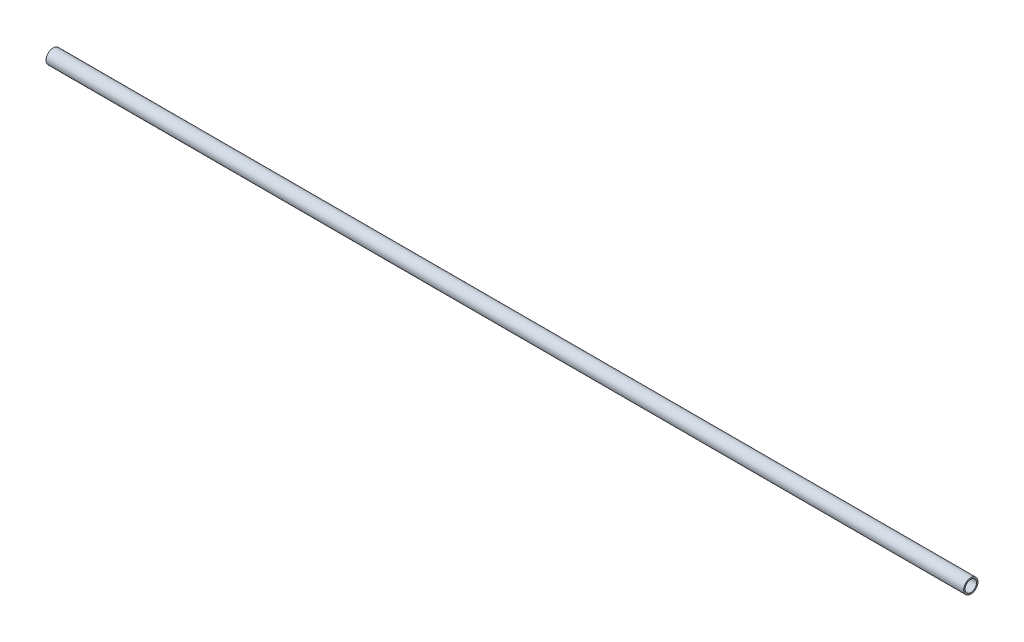
ISO-10303-21;
HEADER;
FILE_DESCRIPTION(('STEP AP214'),'2;1');
FILE_NAME('part.step','',(''),(''),'','','');
FILE_SCHEMA(('AUTOMOTIVE_DESIGN { 1 0 10303 214 1 1 1 1 }'));
ENDSEC;
DATA;
#1=APPLICATION_CONTEXT('core data for automotive mechanical design processes');
#2=APPLICATION_PROTOCOL_DEFINITION('international standard','automotive_design',2000,#1);
#3=PRODUCT_CONTEXT('',#1,'mechanical');
#4=PRODUCT('Part','Part','',(#3));
#5=PRODUCT_RELATED_PRODUCT_CATEGORY('part','',(#4));
#6=PRODUCT_DEFINITION_FORMATION('','',#4);
#7=PRODUCT_DEFINITION_CONTEXT('part definition',#1,'design');
#8=PRODUCT_DEFINITION('design','',#6,#7);
#9=PRODUCT_DEFINITION_SHAPE('','',#8);
#10=(LENGTH_UNIT() NAMED_UNIT(*) SI_UNIT(.MILLI.,.METRE.));
#11=(NAMED_UNIT(*) PLANE_ANGLE_UNIT() SI_UNIT($,.RADIAN.));
#12=(NAMED_UNIT(*) SI_UNIT($,.STERADIAN.) SOLID_ANGLE_UNIT());
#13=UNCERTAINTY_MEASURE_WITH_UNIT(LENGTH_MEASURE(1.E-05),#10,'distance_accuracy_value','');
#14=(GEOMETRIC_REPRESENTATION_CONTEXT(3) GLOBAL_UNCERTAINTY_ASSIGNED_CONTEXT((#13)) GLOBAL_UNIT_ASSIGNED_CONTEXT((#10,
#11,#12)) REPRESENTATION_CONTEXT('',''));
#15=CARTESIAN_POINT('',(0.,0.,0.));
#16=DIRECTION('',(0.,0.,1.));
#17=DIRECTION('',(1.,0.,0.));
#18=AXIS2_PLACEMENT_3D('',#15,#16,#17);
#19=CARTESIAN_POINT('',(80.,0.,0.));
#20=DIRECTION('',(1.,0.,0.));
#21=DIRECTION('',(0.,0.,-1.));
#22=AXIS2_PLACEMENT_3D('',#19,#20,#21);
#23=PLANE('',#22);
#24=CARTESIAN_POINT('',(80.,0.,0.));
#25=DIRECTION('',(1.,0.,0.));
#26=DIRECTION('',(0.,0.,-1.));
#27=AXIS2_PLACEMENT_3D('',#24,#25,#26);
#28=CIRCLE('',#27,1.25);
#29=CARTESIAN_POINT('',(80.,0.,-1.25));
#30=VERTEX_POINT('',#29);
#31=EDGE_CURVE('E12',#30,#30,#28,.T.);
#32=ORIENTED_EDGE('',*,*,#31,.T.);
#33=EDGE_LOOP('',(#32));
#34=FACE_BOUND('',#33,.T.);
#35=CARTESIAN_POINT('',(80.,0.,0.));
#36=DIRECTION('',(1.,0.,0.));
#37=DIRECTION('',(0.,0.,-1.));
#38=AXIS2_PLACEMENT_3D('',#35,#36,#37);
#39=CIRCLE('',#38,1.);
#40=CARTESIAN_POINT('',(80.,0.,-1.));
#41=VERTEX_POINT('',#40);
#42=EDGE_CURVE('E52',#41,#41,#39,.T.);
#43=ORIENTED_EDGE('',*,*,#42,.F.);
#44=EDGE_LOOP('',(#43));
#45=FACE_BOUND('',#44,.T.);
#46=ADVANCED_FACE('F41',(#34,#45),#23,.T.);
#47=CARTESIAN_POINT('',(-80.,0.,0.));
#48=DIRECTION('',(1.,0.,0.));
#49=DIRECTION('',(0.,0.,-1.));
#50=AXIS2_PLACEMENT_3D('',#47,#48,#49);
#51=PLANE('',#50);
#52=CARTESIAN_POINT('',(-80.,0.,0.));
#53=DIRECTION('',(1.,0.,0.));
#54=DIRECTION('',(0.,0.,-1.));
#55=AXIS2_PLACEMENT_3D('',#52,#53,#54);
#56=CIRCLE('',#55,1.25);
#57=CARTESIAN_POINT('',(-80.,0.,-1.25));
#58=VERTEX_POINT('',#57);
#59=EDGE_CURVE('E45',#58,#58,#56,.T.);
#60=ORIENTED_EDGE('',*,*,#59,.F.);
#61=EDGE_LOOP('',(#60));
#62=FACE_BOUND('',#61,.T.);
#63=CARTESIAN_POINT('',(-80.,0.,0.));
#64=DIRECTION('',(1.,0.,0.));
#65=DIRECTION('',(0.,0.,-1.));
#66=AXIS2_PLACEMENT_3D('',#63,#64,#65);
#67=CIRCLE('',#66,1.);
#68=CARTESIAN_POINT('',(-80.,0.,-1.));
#69=VERTEX_POINT('',#68);
#70=EDGE_CURVE('E54',#69,#69,#67,.T.);
#71=ORIENTED_EDGE('',*,*,#70,.T.);
#72=EDGE_LOOP('',(#71));
#73=FACE_BOUND('',#72,.T.);
#74=ADVANCED_FACE('F64',(#62,#73),#51,.F.);
#75=CARTESIAN_POINT('',(80.,0.,0.));
#76=DIRECTION('',(-1.,0.,0.));
#77=DIRECTION('',(0.,0.,1.));
#78=AXIS2_PLACEMENT_3D('',#75,#76,#77);
#79=CYLINDRICAL_SURFACE('',#78,1.25);
#80=ORIENTED_EDGE('',*,*,#31,.F.);
#81=EDGE_LOOP('',(#80));
#82=FACE_BOUND('',#81,.T.);
#83=ORIENTED_EDGE('',*,*,#59,.T.);
#84=EDGE_LOOP('',(#83));
#85=FACE_BOUND('',#84,.T.);
#86=ADVANCED_FACE('F43',(#82,#85),#79,.T.);
#87=CARTESIAN_POINT('',(80.,0.,0.));
#88=DIRECTION('',(-1.,0.,0.));
#89=DIRECTION('',(0.,0.,1.));
#90=AXIS2_PLACEMENT_3D('',#87,#88,#89);
#91=CYLINDRICAL_SURFACE('',#90,1.);
#92=ORIENTED_EDGE('',*,*,#42,.T.);
#93=EDGE_LOOP('',(#92));
#94=FACE_BOUND('',#93,.T.);
#95=ORIENTED_EDGE('',*,*,#70,.F.);
#96=EDGE_LOOP('',(#95));
#97=FACE_BOUND('',#96,.T.);
#98=ADVANCED_FACE('F60',(#94,#97),#91,.F.);
#99=CLOSED_SHELL('',(#46,#74,#86,#98));
#100=MANIFOLD_SOLID_BREP('B2',#99);
#101=ADVANCED_BREP_SHAPE_REPRESENTATION('',(#18,#100),#14);
#102=SHAPE_DEFINITION_REPRESENTATION(#9,#101);
ENDSEC;
END-ISO-10303-21;
